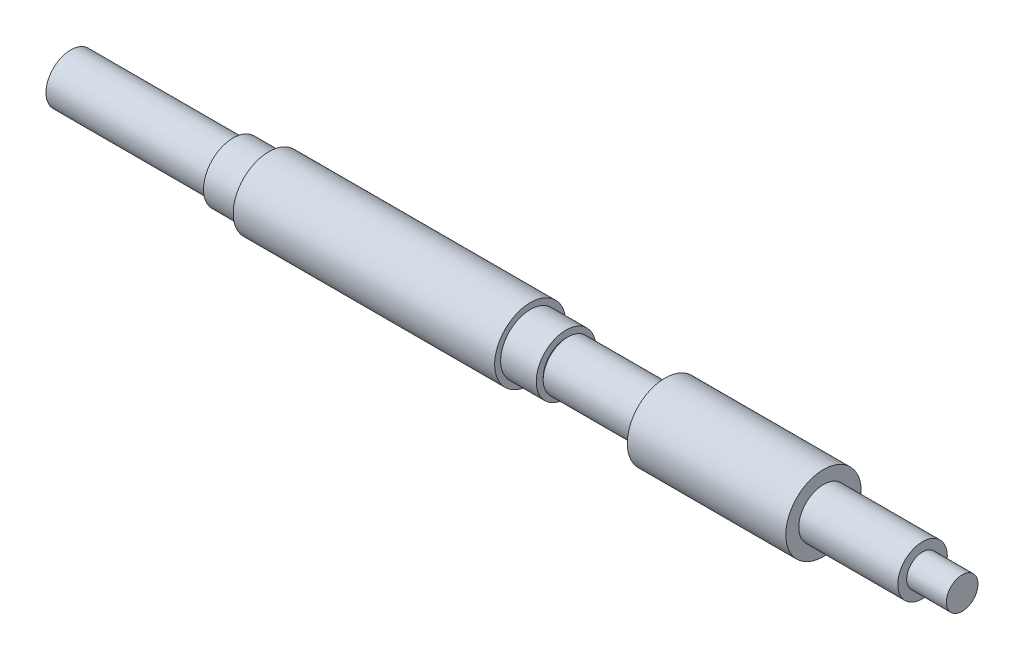
ISO-10303-21;
HEADER;
FILE_DESCRIPTION(('STEP AP214'),'2;1');
FILE_NAME('part.step','',(''),(''),'','','');
FILE_SCHEMA(('AUTOMOTIVE_DESIGN { 1 0 10303 214 1 1 1 1 }'));
ENDSEC;
DATA;
#1=APPLICATION_CONTEXT('core data for automotive mechanical design processes');
#2=APPLICATION_PROTOCOL_DEFINITION('international standard','automotive_design',2000,#1);
#3=PRODUCT_CONTEXT('',#1,'mechanical');
#4=PRODUCT('Part','Part','',(#3));
#5=PRODUCT_RELATED_PRODUCT_CATEGORY('part','',(#4));
#6=PRODUCT_DEFINITION_FORMATION('','',#4);
#7=PRODUCT_DEFINITION_CONTEXT('part definition',#1,'design');
#8=PRODUCT_DEFINITION('design','',#6,#7);
#9=PRODUCT_DEFINITION_SHAPE('','',#8);
#10=(LENGTH_UNIT() NAMED_UNIT(*) SI_UNIT(.MILLI.,.METRE.));
#11=(NAMED_UNIT(*) PLANE_ANGLE_UNIT() SI_UNIT($,.RADIAN.));
#12=(NAMED_UNIT(*) SI_UNIT($,.STERADIAN.) SOLID_ANGLE_UNIT());
#13=UNCERTAINTY_MEASURE_WITH_UNIT(LENGTH_MEASURE(1.E-05),#10,'distance_accuracy_value','');
#14=(GEOMETRIC_REPRESENTATION_CONTEXT(3) GLOBAL_UNCERTAINTY_ASSIGNED_CONTEXT((#13)) GLOBAL_UNIT_ASSIGNED_CONTEXT((#10,
#11,#12)) REPRESENTATION_CONTEXT('',''));
#15=CARTESIAN_POINT('',(0.,0.,0.));
#16=DIRECTION('',(0.,0.,1.));
#17=DIRECTION('',(1.,0.,0.));
#18=AXIS2_PLACEMENT_3D('',#15,#16,#17);
#19=CARTESIAN_POINT('',(300.,0.,0.));
#20=DIRECTION('',(-1.,0.,0.));
#21=DIRECTION('',(0.,0.,1.));
#22=AXIS2_PLACEMENT_3D('',#19,#20,#21);
#23=PLANE('',#22);
#24=CARTESIAN_POINT('',(300.,0.,0.));
#25=DIRECTION('',(1.,0.,0.));
#26=DIRECTION('',(0.,0.,-1.));
#27=AXIS2_PLACEMENT_3D('',#24,#25,#26);
#28=CIRCLE('',#27,19.05);
#29=CARTESIAN_POINT('',(300.,0.,-19.05));
#30=VERTEX_POINT('',#29);
#31=EDGE_CURVE('E54',#30,#30,#28,.T.);
#32=ORIENTED_EDGE('',*,*,#31,.F.);
#33=EDGE_LOOP('',(#32));
#34=FACE_BOUND('',#33,.T.);
#35=ADVANCED_FACE('F44',(#34),#23,.T.);
#36=CARTESIAN_POINT('',(450.,0.,0.));
#37=DIRECTION('',(1.,0.,0.));
#38=DIRECTION('',(0.,0.,-1.));
#39=AXIS2_PLACEMENT_3D('',#36,#37,#38);
#40=PLANE('',#39);
#41=CARTESIAN_POINT('',(450.,0.,0.));
#42=DIRECTION('',(1.,0.,0.));
#43=DIRECTION('',(0.,0.,-1.));
#44=AXIS2_PLACEMENT_3D('',#41,#42,#43);
#45=CIRCLE('',#44,8.);
#46=CARTESIAN_POINT('',(450.,0.,-8.));
#47=VERTEX_POINT('',#46);
#48=EDGE_CURVE('E12',#47,#47,#45,.T.);
#49=ORIENTED_EDGE('',*,*,#48,.T.);
#50=EDGE_LOOP('',(#49));
#51=FACE_BOUND('',#50,.T.);
#52=ADVANCED_FACE('F83',(#51),#40,.T.);
#53=CARTESIAN_POINT('',(450.,0.,0.));
#54=DIRECTION('',(-1.,0.,0.));
#55=DIRECTION('',(0.,0.,1.));
#56=AXIS2_PLACEMENT_3D('',#53,#54,#55);
#57=CYLINDRICAL_SURFACE('',#56,8.);
#58=ORIENTED_EDGE('',*,*,#48,.F.);
#59=EDGE_LOOP('',(#58));
#60=FACE_BOUND('',#59,.T.);
#61=CARTESIAN_POINT('',(430.,0.,0.));
#62=DIRECTION('',(1.,0.,0.));
#63=DIRECTION('',(0.,0.,-1.));
#64=AXIS2_PLACEMENT_3D('',#61,#62,#63);
#65=CIRCLE('',#64,8.);
#66=CARTESIAN_POINT('',(430.,0.,-8.));
#67=VERTEX_POINT('',#66);
#68=EDGE_CURVE('E64',#67,#67,#65,.T.);
#69=ORIENTED_EDGE('',*,*,#68,.T.);
#70=EDGE_LOOP('',(#69));
#71=FACE_BOUND('',#70,.T.);
#72=ADVANCED_FACE('F87',(#60,#71),#57,.T.);
#73=CARTESIAN_POINT('',(430.,0.,0.));
#74=DIRECTION('',(1.,0.,0.));
#75=DIRECTION('',(0.,0.,-1.));
#76=AXIS2_PLACEMENT_3D('',#73,#74,#75);
#77=PLANE('',#76);
#78=ORIENTED_EDGE('',*,*,#68,.F.);
#79=EDGE_LOOP('',(#78));
#80=FACE_BOUND('',#79,.T.);
#81=CARTESIAN_POINT('',(430.,0.,0.));
#82=DIRECTION('',(1.,0.,0.));
#83=DIRECTION('',(0.,0.,-1.));
#84=AXIS2_PLACEMENT_3D('',#81,#82,#83);
#85=CIRCLE('',#84,12.5);
#86=CARTESIAN_POINT('',(430.,0.,-12.5));
#87=VERTEX_POINT('',#86);
#88=EDGE_CURVE('E50',#87,#87,#85,.T.);
#89=ORIENTED_EDGE('',*,*,#88,.T.);
#90=EDGE_LOOP('',(#89));
#91=FACE_BOUND('',#90,.T.);
#92=ADVANCED_FACE('F91',(#80,#91),#77,.T.);
#93=CARTESIAN_POINT('',(430.,0.,0.));
#94=DIRECTION('',(-1.,0.,0.));
#95=DIRECTION('',(0.,0.,1.));
#96=AXIS2_PLACEMENT_3D('',#93,#94,#95);
#97=CYLINDRICAL_SURFACE('',#96,12.5);
#98=ORIENTED_EDGE('',*,*,#88,.F.);
#99=EDGE_LOOP('',(#98));
#100=FACE_BOUND('',#99,.T.);
#101=CARTESIAN_POINT('',(380.,0.,0.));
#102=DIRECTION('',(1.,0.,0.));
#103=DIRECTION('',(0.,0.,-1.));
#104=AXIS2_PLACEMENT_3D('',#101,#102,#103);
#105=CIRCLE('',#104,12.5);
#106=CARTESIAN_POINT('',(380.,0.,-12.5));
#107=VERTEX_POINT('',#106);
#108=EDGE_CURVE('E62',#107,#107,#105,.T.);
#109=ORIENTED_EDGE('',*,*,#108,.T.);
#110=EDGE_LOOP('',(#109));
#111=FACE_BOUND('',#110,.T.);
#112=ADVANCED_FACE('F97',(#100,#111),#97,.T.);
#113=CARTESIAN_POINT('',(380.,0.,0.));
#114=DIRECTION('',(1.,0.,0.));
#115=DIRECTION('',(0.,0.,-1.));
#116=AXIS2_PLACEMENT_3D('',#113,#114,#115);
#117=PLANE('',#116);
#118=ORIENTED_EDGE('',*,*,#108,.F.);
#119=EDGE_LOOP('',(#118));
#120=FACE_BOUND('',#119,.T.);
#121=CARTESIAN_POINT('',(380.,0.,0.));
#122=DIRECTION('',(1.,0.,0.));
#123=DIRECTION('',(0.,0.,-1.));
#124=AXIS2_PLACEMENT_3D('',#121,#122,#123);
#125=CIRCLE('',#124,19.05);
#126=CARTESIAN_POINT('',(380.,0.,-19.05));
#127=VERTEX_POINT('',#126);
#128=EDGE_CURVE('E59',#127,#127,#125,.T.);
#129=ORIENTED_EDGE('',*,*,#128,.T.);
#130=EDGE_LOOP('',(#129));
#131=FACE_BOUND('',#130,.T.);
#132=ADVANCED_FACE('F74',(#120,#131),#117,.T.);
#133=CARTESIAN_POINT('',(380.,0.,0.));
#134=DIRECTION('',(-1.,0.,0.));
#135=DIRECTION('',(0.,0.,1.));
#136=AXIS2_PLACEMENT_3D('',#133,#134,#135);
#137=CYLINDRICAL_SURFACE('',#136,19.05);
#138=ORIENTED_EDGE('',*,*,#128,.F.);
#139=EDGE_LOOP('',(#138));
#140=FACE_BOUND('',#139,.T.);
#141=ORIENTED_EDGE('',*,*,#31,.T.);
#142=EDGE_LOOP('',(#141));
#143=FACE_BOUND('',#142,.T.);
#144=ADVANCED_FACE('F76',(#140,#143),#137,.T.);
#145=CLOSED_SHELL('',(#35,#52,#72,#92,#112,#132,#144));
#146=MANIFOLD_SOLID_BREP('B2',#145);
#147=CARTESIAN_POINT('',(82.,0.,0.));
#148=DIRECTION('',(1.,0.,0.));
#149=DIRECTION('',(0.,0.,-1.));
#150=AXIS2_PLACEMENT_3D('',#147,#148,#149);
#151=CYLINDRICAL_SURFACE('',#150,15.);
#152=CARTESIAN_POINT('',(82.,0.,0.));
#153=DIRECTION('',(1.,0.,0.));
#154=DIRECTION('',(0.,0.,-1.));
#155=AXIS2_PLACEMENT_3D('',#152,#153,#154);
#156=CIRCLE('',#155,15.);
#157=CARTESIAN_POINT('',(82.,0.,-15.));
#158=VERTEX_POINT('',#157);
#159=EDGE_CURVE('E176',#158,#158,#156,.T.);
#160=ORIENTED_EDGE('',*,*,#159,.T.);
#161=EDGE_LOOP('',(#160));
#162=FACE_BOUND('',#161,.T.);
#163=CARTESIAN_POINT('',(100.,0.,0.));
#164=DIRECTION('',(1.,0.,0.));
#165=DIRECTION('',(0.,0.,-1.));
#166=AXIS2_PLACEMENT_3D('',#163,#164,#165);
#167=CIRCLE('',#166,15.);
#168=CARTESIAN_POINT('',(100.,0.,-15.));
#169=VERTEX_POINT('',#168);
#170=EDGE_CURVE('E173',#169,#169,#167,.T.);
#171=ORIENTED_EDGE('',*,*,#170,.F.);
#172=EDGE_LOOP('',(#171));
#173=FACE_BOUND('',#172,.T.);
#174=ADVANCED_FACE('F148',(#162,#173),#151,.T.);
#175=CARTESIAN_POINT('',(82.,0.,0.));
#176=DIRECTION('',(1.,0.,0.));
#177=DIRECTION('',(0.,0.,-1.));
#178=AXIS2_PLACEMENT_3D('',#175,#176,#177);
#179=PLANE('',#178);
#180=ORIENTED_EDGE('',*,*,#159,.F.);
#181=EDGE_LOOP('',(#180));
#182=FACE_BOUND('',#181,.T.);
#183=CARTESIAN_POINT('',(82.,0.,0.));
#184=DIRECTION('',(-1.,0.,0.));
#185=DIRECTION('',(0.,0.,1.));
#186=AXIS2_PLACEMENT_3D('',#183,#184,#185);
#187=CIRCLE('',#186,11.5);
#188=CARTESIAN_POINT('',(82.,0.,11.5));
#189=VERTEX_POINT('',#188);
#190=EDGE_CURVE('E337',#189,#189,#187,.T.);
#191=ORIENTED_EDGE('',*,*,#190,.F.);
#192=EDGE_LOOP('',(#191));
#193=FACE_BOUND('',#192,.T.);
#194=ADVANCED_FACE('F185',(#182,#193),#179,.F.);
#195=CARTESIAN_POINT('',(232.,0.,0.));
#196=DIRECTION('',(-1.,0.,0.));
#197=DIRECTION('',(0.,0.,1.));
#198=AXIS2_PLACEMENT_3D('',#195,#196,#197);
#199=CYLINDRICAL_SURFACE('',#198,18.);
#200=CARTESIAN_POINT('',(232.,0.,0.));
#201=DIRECTION('',(1.,0.,0.));
#202=DIRECTION('',(0.,0.,-1.));
#203=AXIS2_PLACEMENT_3D('',#200,#201,#202);
#204=CIRCLE('',#203,18.);
#205=CARTESIAN_POINT('',(232.,0.,-18.));
#206=VERTEX_POINT('',#205);
#207=EDGE_CURVE('E170',#206,#206,#204,.T.);
#208=ORIENTED_EDGE('',*,*,#207,.F.);
#209=EDGE_LOOP('',(#208));
#210=FACE_BOUND('',#209,.T.);
#211=CARTESIAN_POINT('',(100.,0.,0.));
#212=DIRECTION('',(1.,0.,0.));
#213=DIRECTION('',(0.,0.,-1.));
#214=AXIS2_PLACEMENT_3D('',#211,#212,#213);
#215=CIRCLE('',#214,18.);
#216=CARTESIAN_POINT('',(100.,0.,-18.));
#217=VERTEX_POINT('',#216);
#218=EDGE_CURVE('E168',#217,#217,#215,.T.);
#219=ORIENTED_EDGE('',*,*,#218,.T.);
#220=EDGE_LOOP('',(#219));
#221=FACE_BOUND('',#220,.T.);
#222=ADVANCED_FACE('F192',(#210,#221),#199,.T.);
#223=CARTESIAN_POINT('',(232.,0.,0.));
#224=DIRECTION('',(1.,0.,0.));
#225=DIRECTION('',(0.,0.,-1.));
#226=AXIS2_PLACEMENT_3D('',#223,#224,#225);
#227=PLANE('',#226);
#228=CARTESIAN_POINT('',(232.,0.,0.));
#229=DIRECTION('',(1.,0.,0.));
#230=DIRECTION('',(0.,0.,-1.));
#231=AXIS2_PLACEMENT_3D('',#228,#229,#230);
#232=CIRCLE('',#231,15.);
#233=CARTESIAN_POINT('',(232.,0.,-15.));
#234=VERTEX_POINT('',#233);
#235=EDGE_CURVE('E156',#234,#234,#232,.T.);
#236=ORIENTED_EDGE('',*,*,#235,.F.);
#237=EDGE_LOOP('',(#236));
#238=FACE_BOUND('',#237,.T.);
#239=ORIENTED_EDGE('',*,*,#207,.T.);
#240=EDGE_LOOP('',(#239));
#241=FACE_BOUND('',#240,.T.);
#242=ADVANCED_FACE('F214',(#238,#241),#227,.T.);
#243=CARTESIAN_POINT('',(100.,0.,0.));
#244=DIRECTION('',(1.,0.,0.));
#245=DIRECTION('',(0.,0.,-1.));
#246=AXIS2_PLACEMENT_3D('',#243,#244,#245);
#247=PLANE('',#246);
#248=ORIENTED_EDGE('',*,*,#170,.T.);
#249=EDGE_LOOP('',(#248));
#250=FACE_BOUND('',#249,.T.);
#251=ORIENTED_EDGE('',*,*,#218,.F.);
#252=EDGE_LOOP('',(#251));
#253=FACE_BOUND('',#252,.T.);
#254=ADVANCED_FACE('F181',(#250,#253),#247,.F.);
#255=CARTESIAN_POINT('',(250.,0.,0.));
#256=DIRECTION('',(-1.,0.,0.));
#257=DIRECTION('',(0.,0.,1.));
#258=AXIS2_PLACEMENT_3D('',#255,#256,#257);
#259=CYLINDRICAL_SURFACE('',#258,15.);
#260=CARTESIAN_POINT('',(250.,0.,0.));
#261=DIRECTION('',(1.,0.,0.));
#262=DIRECTION('',(0.,0.,-1.));
#263=AXIS2_PLACEMENT_3D('',#260,#261,#262);
#264=CIRCLE('',#263,15.);
#265=CARTESIAN_POINT('',(250.,0.,-15.));
#266=VERTEX_POINT('',#265);
#267=EDGE_CURVE('E166',#266,#266,#264,.T.);
#268=ORIENTED_EDGE('',*,*,#267,.F.);
#269=EDGE_LOOP('',(#268));
#270=FACE_BOUND('',#269,.T.);
#271=ORIENTED_EDGE('',*,*,#235,.T.);
#272=EDGE_LOOP('',(#271));
#273=FACE_BOUND('',#272,.T.);
#274=ADVANCED_FACE('F202',(#270,#273),#259,.T.);
#275=CARTESIAN_POINT('',(250.,0.,0.));
#276=DIRECTION('',(1.,0.,0.));
#277=DIRECTION('',(0.,0.,-1.));
#278=AXIS2_PLACEMENT_3D('',#275,#276,#277);
#279=PLANE('',#278);
#280=ORIENTED_EDGE('',*,*,#267,.T.);
#281=EDGE_LOOP('',(#280));
#282=FACE_BOUND('',#281,.T.);
#283=CARTESIAN_POINT('',(250.,0.,0.));
#284=DIRECTION('',(1.,0.,0.));
#285=DIRECTION('',(0.,0.,-1.));
#286=AXIS2_PLACEMENT_3D('',#283,#284,#285);
#287=CIRCLE('',#286,11.5);
#288=CARTESIAN_POINT('',(250.,0.,-11.5));
#289=VERTEX_POINT('',#288);
#290=EDGE_CURVE('E330',#289,#289,#287,.T.);
#291=ORIENTED_EDGE('',*,*,#290,.F.);
#292=EDGE_LOOP('',(#291));
#293=FACE_BOUND('',#292,.T.);
#294=ADVANCED_FACE('F198',(#282,#293),#279,.T.);
#295=CARTESIAN_POINT('',(81.,0.,0.));
#296=DIRECTION('',(-1.,0.,0.));
#297=DIRECTION('',(0.,0.,1.));
#298=AXIS2_PLACEMENT_3D('',#295,#296,#297);
#299=PLANE('',#298);
#300=CARTESIAN_POINT('',(81.,0.,0.));
#301=DIRECTION('',(-1.,0.,0.));
#302=DIRECTION('',(0.,0.,1.));
#303=AXIS2_PLACEMENT_3D('',#300,#301,#302);
#304=CIRCLE('',#303,12.5);
#305=CARTESIAN_POINT('',(81.,0.,12.5));
#306=VERTEX_POINT('',#305);
#307=EDGE_CURVE('E164',#306,#306,#304,.T.);
#308=ORIENTED_EDGE('',*,*,#307,.F.);
#309=EDGE_LOOP('',(#308));
#310=FACE_BOUND('',#309,.T.);
#311=CARTESIAN_POINT('',(81.,0.,0.));
#312=DIRECTION('',(-1.,0.,0.));
#313=DIRECTION('',(0.,0.,1.));
#314=AXIS2_PLACEMENT_3D('',#311,#312,#313);
#315=CIRCLE('',#314,11.5);
#316=CARTESIAN_POINT('',(81.,0.,11.5));
#317=VERTEX_POINT('',#316);
#318=EDGE_CURVE('E338',#317,#317,#315,.T.);
#319=ORIENTED_EDGE('',*,*,#318,.T.);
#320=EDGE_LOOP('',(#319));
#321=FACE_BOUND('',#320,.T.);
#322=ADVANCED_FACE('F188',(#310,#321),#299,.F.);
#323=CARTESIAN_POINT('',(81.,0.,0.));
#324=DIRECTION('',(1.,0.,0.));
#325=DIRECTION('',(0.,0.,-1.));
#326=AXIS2_PLACEMENT_3D('',#323,#324,#325);
#327=CYLINDRICAL_SURFACE('',#326,11.5);
#328=ORIENTED_EDGE('',*,*,#318,.F.);
#329=EDGE_LOOP('',(#328));
#330=FACE_BOUND('',#329,.T.);
#331=ORIENTED_EDGE('',*,*,#190,.T.);
#332=EDGE_LOOP('',(#331));
#333=FACE_BOUND('',#332,.T.);
#334=ADVANCED_FACE('F197',(#330,#333),#327,.T.);
#335=CARTESIAN_POINT('',(0.,0.,0.));
#336=DIRECTION('',(1.,0.,0.));
#337=DIRECTION('',(0.,0.,-1.));
#338=AXIS2_PLACEMENT_3D('',#335,#336,#337);
#339=PLANE('',#338);
#340=CARTESIAN_POINT('',(0.,0.,0.));
#341=DIRECTION('',(1.,0.,0.));
#342=DIRECTION('',(0.,0.,-1.));
#343=AXIS2_PLACEMENT_3D('',#340,#341,#342);
#344=CIRCLE('',#343,12.5);
#345=CARTESIAN_POINT('',(0.,0.,-12.5));
#346=VERTEX_POINT('',#345);
#347=EDGE_CURVE('E152',#346,#346,#344,.T.);
#348=ORIENTED_EDGE('',*,*,#347,.F.);
#349=EDGE_LOOP('',(#348));
#350=FACE_BOUND('',#349,.T.);
#351=ADVANCED_FACE('F288',(#350),#339,.F.);
#352=CARTESIAN_POINT('',(100.,0.,0.));
#353=DIRECTION('',(-1.,0.,0.));
#354=DIRECTION('',(0.,0.,1.));
#355=AXIS2_PLACEMENT_3D('',#352,#353,#354);
#356=CYLINDRICAL_SURFACE('',#355,12.5);
#357=ORIENTED_EDGE('',*,*,#307,.T.);
#358=EDGE_LOOP('',(#357));
#359=FACE_BOUND('',#358,.T.);
#360=ORIENTED_EDGE('',*,*,#347,.T.);
#361=EDGE_LOOP('',(#360));
#362=FACE_BOUND('',#361,.T.);
#363=ADVANCED_FACE('F295',(#359,#362),#356,.T.);
#364=CARTESIAN_POINT('',(251.,0.,0.));
#365=DIRECTION('',(1.,0.,0.));
#366=DIRECTION('',(0.,0.,-1.));
#367=AXIS2_PLACEMENT_3D('',#364,#365,#366);
#368=PLANE('',#367);
#369=CARTESIAN_POINT('',(251.,0.,0.));
#370=DIRECTION('',(1.,0.,0.));
#371=DIRECTION('',(0.,0.,-1.));
#372=AXIS2_PLACEMENT_3D('',#369,#370,#371);
#373=CIRCLE('',#372,12.5);
#374=CARTESIAN_POINT('',(251.,0.,-12.5));
#375=VERTEX_POINT('',#374);
#376=EDGE_CURVE('E332',#375,#375,#373,.T.);
#377=ORIENTED_EDGE('',*,*,#376,.F.);
#378=EDGE_LOOP('',(#377));
#379=FACE_BOUND('',#378,.T.);
#380=CARTESIAN_POINT('',(251.,0.,0.));
#381=DIRECTION('',(1.,0.,0.));
#382=DIRECTION('',(0.,0.,-1.));
#383=AXIS2_PLACEMENT_3D('',#380,#381,#382);
#384=CIRCLE('',#383,11.5);
#385=CARTESIAN_POINT('',(251.,0.,-11.5));
#386=VERTEX_POINT('',#385);
#387=EDGE_CURVE('E327',#386,#386,#384,.T.);
#388=ORIENTED_EDGE('',*,*,#387,.T.);
#389=EDGE_LOOP('',(#388));
#390=FACE_BOUND('',#389,.T.);
#391=ADVANCED_FACE('F299',(#379,#390),#368,.F.);
#392=CARTESIAN_POINT('',(251.,0.,0.));
#393=DIRECTION('',(-1.,0.,0.));
#394=DIRECTION('',(0.,0.,1.));
#395=AXIS2_PLACEMENT_3D('',#392,#393,#394);
#396=CYLINDRICAL_SURFACE('',#395,11.5);
#397=ORIENTED_EDGE('',*,*,#387,.F.);
#398=EDGE_LOOP('',(#397));
#399=FACE_BOUND('',#398,.T.);
#400=ORIENTED_EDGE('',*,*,#290,.T.);
#401=EDGE_LOOP('',(#400));
#402=FACE_BOUND('',#401,.T.);
#403=ADVANCED_FACE('F272',(#399,#402),#396,.T.);
#404=CARTESIAN_POINT('',(300.,0.,0.));
#405=DIRECTION('',(-1.,0.,0.));
#406=DIRECTION('',(0.,0.,1.));
#407=AXIS2_PLACEMENT_3D('',#404,#405,#406);
#408=PLANE('',#407);
#409=CARTESIAN_POINT('',(300.,0.,0.));
#410=DIRECTION('',(1.,0.,0.));
#411=DIRECTION('',(0.,0.,-1.));
#412=AXIS2_PLACEMENT_3D('',#409,#410,#411);
#413=CIRCLE('',#412,12.5);
#414=CARTESIAN_POINT('',(300.,0.,-12.5));
#415=VERTEX_POINT('',#414);
#416=EDGE_CURVE('E43',#415,#415,#413,.T.);
#417=ORIENTED_EDGE('',*,*,#416,.T.);
#418=EDGE_LOOP('',(#417));
#419=FACE_BOUND('',#418,.T.);
#420=ADVANCED_FACE('F150',(#419),#408,.F.);
#421=CARTESIAN_POINT('',(300.,0.,0.));
#422=DIRECTION('',(-1.,0.,0.));
#423=DIRECTION('',(0.,0.,1.));
#424=AXIS2_PLACEMENT_3D('',#421,#422,#423);
#425=CYLINDRICAL_SURFACE('',#424,12.5);
#426=ORIENTED_EDGE('',*,*,#376,.T.);
#427=EDGE_LOOP('',(#426));
#428=FACE_BOUND('',#427,.T.);
#429=ORIENTED_EDGE('',*,*,#416,.F.);
#430=EDGE_LOOP('',(#429));
#431=FACE_BOUND('',#430,.T.);
#432=ADVANCED_FACE('F212',(#428,#431),#425,.T.);
#433=CLOSED_SHELL('',(#174,#194,#222,#242,#254,#274,#294,#322,#334,#351,#363,#391,#403,#420,#432));
#434=MANIFOLD_SOLID_BREP('B7',#433);
#435=ADVANCED_BREP_SHAPE_REPRESENTATION('',(#18,#146,#434),#14);
#436=SHAPE_DEFINITION_REPRESENTATION(#9,#435);
ENDSEC;
END-ISO-10303-21;
